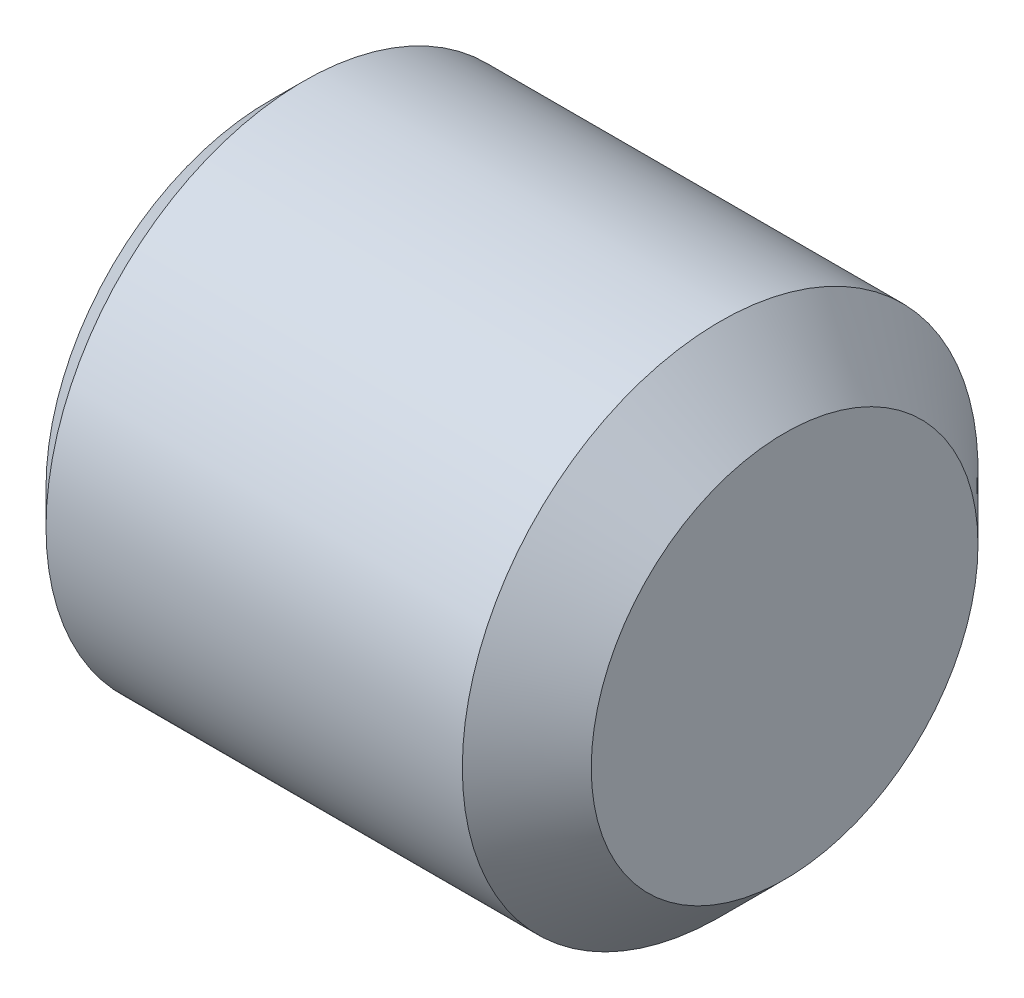
ISO-10303-21;
HEADER;
FILE_DESCRIPTION(('STEP AP214'),'2;1');
FILE_NAME('part.step','',(''),(''),'','','');
FILE_SCHEMA(('AUTOMOTIVE_DESIGN { 1 0 10303 214 1 1 1 1 }'));
ENDSEC;
DATA;
#1=APPLICATION_CONTEXT('core data for automotive mechanical design processes');
#2=APPLICATION_PROTOCOL_DEFINITION('international standard','automotive_design',2000,#1);
#3=PRODUCT_CONTEXT('',#1,'mechanical');
#4=PRODUCT('Part','Part','',(#3));
#5=PRODUCT_RELATED_PRODUCT_CATEGORY('part','',(#4));
#6=PRODUCT_DEFINITION_FORMATION('','',#4);
#7=PRODUCT_DEFINITION_CONTEXT('part definition',#1,'design');
#8=PRODUCT_DEFINITION('design','',#6,#7);
#9=PRODUCT_DEFINITION_SHAPE('','',#8);
#10=(LENGTH_UNIT() NAMED_UNIT(*) SI_UNIT(.MILLI.,.METRE.));
#11=(NAMED_UNIT(*) PLANE_ANGLE_UNIT() SI_UNIT($,.RADIAN.));
#12=(NAMED_UNIT(*) SI_UNIT($,.STERADIAN.) SOLID_ANGLE_UNIT());
#13=UNCERTAINTY_MEASURE_WITH_UNIT(LENGTH_MEASURE(1.E-05),#10,'distance_accuracy_value','');
#14=(GEOMETRIC_REPRESENTATION_CONTEXT(3) GLOBAL_UNCERTAINTY_ASSIGNED_CONTEXT((#13)) GLOBAL_UNIT_ASSIGNED_CONTEXT((#10,
#11,#12)) REPRESENTATION_CONTEXT('',''));
#15=CARTESIAN_POINT('',(0.,0.,0.));
#16=DIRECTION('',(0.,0.,1.));
#17=DIRECTION('',(1.,0.,0.));
#18=AXIS2_PLACEMENT_3D('',#15,#16,#17);
#19=CARTESIAN_POINT('',(8.00000000011369,0.,5.77350269189626));
#20=DIRECTION('',(-1.,0.,0.));
#21=DIRECTION('',(0.,0.,1.));
#22=AXIS2_PLACEMENT_3D('',#19,#20,#21);
#23=PLANE('',#22);
#24=CARTESIAN_POINT('',(8.00000000011369,0.,0.));
#25=DIRECTION('',(-1.,0.,0.));
#26=DIRECTION('',(0.,0.,1.));
#27=AXIS2_PLACEMENT_3D('',#24,#25,#26);
#28=CIRCLE('',#27,5.);
#29=CARTESIAN_POINT('',(8.00000000011369,2.5,4.33012701892219));
#30=VERTEX_POINT('',#29);
#31=CARTESIAN_POINT('',(8.00000000011369,5.,0.));
#32=VERTEX_POINT('',#31);
#33=EDGE_CURVE('E54',#30,#32,#28,.T.);
#34=ORIENTED_EDGE('',*,*,#33,.F.);
#35=DIRECTION('',(0.,0.866025403784438,-0.5));
#36=VECTOR('',#35,1.);
#37=CARTESIAN_POINT('',(8.00000000011369,0.,5.77350269189626));
#38=LINE('',#37,#36);
#39=CARTESIAN_POINT('',(8.00000000011369,5.,2.88675134594813));
#40=VERTEX_POINT('',#39);
#41=EDGE_CURVE('E244',#30,#40,#38,.T.);
#42=ORIENTED_EDGE('',*,*,#41,.T.);
#43=DIRECTION('',(0.,0.,-1.));
#44=VECTOR('',#43,1.);
#45=CARTESIAN_POINT('',(8.00000000011369,5.,2.88675134594813));
#46=LINE('',#45,#44);
#47=EDGE_CURVE('E237',#40,#32,#46,.T.);
#48=ORIENTED_EDGE('',*,*,#47,.T.);
#49=EDGE_LOOP('',(#34,#42,#48));
#50=FACE_BOUND('',#49,.T.);
#51=ADVANCED_FACE('F43',(#50),#23,.T.);
#52=CARTESIAN_POINT('',(8.00000000011369,2.5,-4.3301270189222));
#53=VERTEX_POINT('',#52);
#54=EDGE_CURVE('E11',#32,#53,#28,.T.);
#55=ORIENTED_EDGE('',*,*,#54,.F.);
#56=CARTESIAN_POINT('',(8.00000000011369,5.,-2.88675134594813));
#57=VERTEX_POINT('',#56);
#58=EDGE_CURVE('E240',#32,#57,#46,.T.);
#59=ORIENTED_EDGE('',*,*,#58,.T.);
#60=DIRECTION('',(0.,-0.866025403784439,-0.5));
#61=VECTOR('',#60,1.);
#62=CARTESIAN_POINT('',(8.00000000011369,5.,-2.88675134594813));
#63=LINE('',#62,#61);
#64=EDGE_CURVE('E233',#57,#53,#63,.T.);
#65=ORIENTED_EDGE('',*,*,#64,.T.);
#66=EDGE_LOOP('',(#55,#59,#65));
#67=FACE_BOUND('',#66,.T.);
#68=ADVANCED_FACE('F130',(#67),#23,.T.);
#69=CARTESIAN_POINT('',(8.00000000011369,-2.5,-4.3301270189222));
#70=VERTEX_POINT('',#69);
#71=EDGE_CURVE('E52',#53,#70,#28,.T.);
#72=ORIENTED_EDGE('',*,*,#71,.F.);
#73=CARTESIAN_POINT('',(8.00000000011369,0.,-5.77350269189626));
#74=VERTEX_POINT('',#73);
#75=EDGE_CURVE('E236',#53,#74,#63,.T.);
#76=ORIENTED_EDGE('',*,*,#75,.T.);
#77=DIRECTION('',(0.,-0.866025403784439,0.5));
#78=VECTOR('',#77,1.);
#79=CARTESIAN_POINT('',(8.00000000011369,0.,-5.77350269189626));
#80=LINE('',#79,#78);
#81=EDGE_CURVE('E229',#74,#70,#80,.T.);
#82=ORIENTED_EDGE('',*,*,#81,.T.);
#83=EDGE_LOOP('',(#72,#76,#82));
#84=FACE_BOUND('',#83,.T.);
#85=ADVANCED_FACE('F136',(#84),#23,.T.);
#86=CARTESIAN_POINT('',(8.00000000011369,-5.,0.));
#87=VERTEX_POINT('',#86);
#88=EDGE_CURVE('E267',#70,#87,#28,.T.);
#89=ORIENTED_EDGE('',*,*,#88,.F.);
#90=CARTESIAN_POINT('',(8.00000000011369,-5.,-2.88675134594813));
#91=VERTEX_POINT('',#90);
#92=EDGE_CURVE('E232',#70,#91,#80,.T.);
#93=ORIENTED_EDGE('',*,*,#92,.T.);
#94=DIRECTION('',(0.,0.,1.));
#95=VECTOR('',#94,1.);
#96=CARTESIAN_POINT('',(8.00000000011369,-5.,-2.88675134594813));
#97=LINE('',#96,#95);
#98=EDGE_CURVE('E200',#91,#87,#97,.T.);
#99=ORIENTED_EDGE('',*,*,#98,.T.);
#100=EDGE_LOOP('',(#89,#93,#99));
#101=FACE_BOUND('',#100,.T.);
#102=ADVANCED_FACE('F275',(#101),#23,.T.);
#103=CARTESIAN_POINT('',(8.00000000011369,-2.5,4.3301270189222));
#104=VERTEX_POINT('',#103);
#105=EDGE_CURVE('E61',#87,#104,#28,.T.);
#106=ORIENTED_EDGE('',*,*,#105,.F.);
#107=CARTESIAN_POINT('',(8.00000000011369,-5.,2.88675134594813));
#108=VERTEX_POINT('',#107);
#109=EDGE_CURVE('E228',#87,#108,#97,.T.);
#110=ORIENTED_EDGE('',*,*,#109,.T.);
#111=DIRECTION('',(0.,0.866025403784439,0.5));
#112=VECTOR('',#111,1.);
#113=CARTESIAN_POINT('',(8.00000000011369,-5.,2.88675134594813));
#114=LINE('',#113,#112);
#115=EDGE_CURVE('E245',#108,#104,#114,.T.);
#116=ORIENTED_EDGE('',*,*,#115,.T.);
#117=EDGE_LOOP('',(#106,#110,#116));
#118=FACE_BOUND('',#117,.T.);
#119=ADVANCED_FACE('F128',(#118),#23,.T.);
#120=CARTESIAN_POINT('',(0.,8.647,0.));
#121=DIRECTION('',(1.,0.,0.));
#122=DIRECTION('',(0.,0.,-1.));
#123=AXIS2_PLACEMENT_3D('',#120,#121,#122);
#124=PLANE('',#123);
#125=DIRECTION('',(0.,0.866025403784438,-0.5));
#126=VECTOR('',#125,1.);
#127=CARTESIAN_POINT('',(1.13686837721616E-10,0.,5.77350269189626));
#128=LINE('',#127,#126);
#129=CARTESIAN_POINT('',(0.,0.,5.77350269189626));
#130=VERTEX_POINT('',#129);
#131=CARTESIAN_POINT('',(1.13686837721616E-10,5.,2.88675134594813));
#132=VERTEX_POINT('',#131);
#133=EDGE_CURVE('E222',#130,#132,#128,.T.);
#134=ORIENTED_EDGE('',*,*,#133,.F.);
#135=DIRECTION('',(0.,0.866025403784439,0.5));
#136=VECTOR('',#135,1.);
#137=CARTESIAN_POINT('',(1.13686837721616E-10,-5.,2.88675134594813));
#138=LINE('',#137,#136);
#139=CARTESIAN_POINT('',(1.13686837721616E-10,-5.,2.88675134594813));
#140=VERTEX_POINT('',#139);
#141=EDGE_CURVE('E69',#140,#130,#138,.T.);
#142=ORIENTED_EDGE('',*,*,#141,.F.);
#143=DIRECTION('',(0.,0.,1.));
#144=VECTOR('',#143,1.);
#145=CARTESIAN_POINT('',(1.13686837721616E-10,-5.,-2.88675134594813));
#146=LINE('',#145,#144);
#147=CARTESIAN_POINT('',(1.13686837721616E-10,-5.,-2.88675134594813));
#148=VERTEX_POINT('',#147);
#149=EDGE_CURVE('E209',#148,#140,#146,.T.);
#150=ORIENTED_EDGE('',*,*,#149,.F.);
#151=DIRECTION('',(0.,-0.866025403784439,0.5));
#152=VECTOR('',#151,1.);
#153=CARTESIAN_POINT('',(1.13686837721616E-10,0.,-5.77350269189626));
#154=LINE('',#153,#152);
#155=CARTESIAN_POINT('',(1.13686837721616E-10,0.,-5.77350269189626));
#156=VERTEX_POINT('',#155);
#157=EDGE_CURVE('E213',#156,#148,#154,.T.);
#158=ORIENTED_EDGE('',*,*,#157,.F.);
#159=DIRECTION('',(0.,-0.866025403784439,-0.5));
#160=VECTOR('',#159,1.);
#161=CARTESIAN_POINT('',(1.13686837721616E-10,5.,-2.88675134594813));
#162=LINE('',#161,#160);
#163=CARTESIAN_POINT('',(1.13686837721616E-10,5.,-2.88675134594813));
#164=VERTEX_POINT('',#163);
#165=EDGE_CURVE('E216',#164,#156,#162,.T.);
#166=ORIENTED_EDGE('',*,*,#165,.F.);
#167=DIRECTION('',(0.,0.,-1.));
#168=VECTOR('',#167,1.);
#169=CARTESIAN_POINT('',(1.13686837721616E-10,5.,2.88675134594813));
#170=LINE('',#169,#168);
#171=EDGE_CURVE('E219',#132,#164,#170,.T.);
#172=ORIENTED_EDGE('',*,*,#171,.F.);
#173=EDGE_LOOP('',(#134,#142,#150,#158,#166,#172));
#174=FACE_BOUND('',#173,.T.);
#175=CARTESIAN_POINT('',(0.,0.,0.));
#176=DIRECTION('',(-1.,0.,0.));
#177=DIRECTION('',(0.,0.,1.));
#178=AXIS2_PLACEMENT_3D('',#175,#176,#177);
#179=CIRCLE('',#178,8.647);
#180=CARTESIAN_POINT('',(0.,0.,8.647));
#181=VERTEX_POINT('',#180);
#182=EDGE_CURVE('E190',#181,#181,#179,.T.);
#183=ORIENTED_EDGE('',*,*,#182,.T.);
#184=EDGE_LOOP('',(#183));
#185=FACE_BOUND('',#184,.T.);
#186=ADVANCED_FACE('F45',(#174,#185),#124,.F.);
#187=CARTESIAN_POINT('',(20.,0.,0.));
#188=DIRECTION('',(-1.,0.,0.));
#189=DIRECTION('',(0.,0.,1.));
#190=AXIS2_PLACEMENT_3D('',#187,#188,#189);
#191=PLANE('',#190);
#192=CARTESIAN_POINT('',(20.,0.,0.));
#193=DIRECTION('',(-1.,0.,0.));
#194=DIRECTION('',(0.,0.,1.));
#195=AXIS2_PLACEMENT_3D('',#192,#193,#194);
#196=CIRCLE('',#195,7.5);
#197=CARTESIAN_POINT('',(20.,0.,7.5));
#198=VERTEX_POINT('',#197);
#199=EDGE_CURVE('E47',#198,#198,#196,.T.);
#200=ORIENTED_EDGE('',*,*,#199,.F.);
#201=EDGE_LOOP('',(#200));
#202=FACE_BOUND('',#201,.T.);
#203=ADVANCED_FACE('F172',(#202),#191,.F.);
#204=CARTESIAN_POINT('',(20.,0.,0.));
#205=DIRECTION('',(-1.,0.,0.));
#206=DIRECTION('',(0.,0.,1.));
#207=AXIS2_PLACEMENT_3D('',#204,#205,#206);
#208=CONICAL_SURFACE('',#207,7.5,0.785398163397444);
#209=CARTESIAN_POINT('',(17.5,0.,0.));
#210=DIRECTION('',(-1.,0.,0.));
#211=DIRECTION('',(0.,0.,1.));
#212=AXIS2_PLACEMENT_3D('',#209,#210,#211);
#213=CIRCLE('',#212,10.);
#214=CARTESIAN_POINT('',(17.5,0.,10.));
#215=VERTEX_POINT('',#214);
#216=EDGE_CURVE('E184',#215,#215,#213,.T.);
#217=ORIENTED_EDGE('',*,*,#216,.F.);
#218=EDGE_LOOP('',(#217));
#219=FACE_BOUND('',#218,.T.);
#220=ORIENTED_EDGE('',*,*,#199,.T.);
#221=EDGE_LOOP('',(#220));
#222=FACE_BOUND('',#221,.T.);
#223=ADVANCED_FACE('F169',(#219,#222),#208,.T.);
#224=CARTESIAN_POINT('',(-10.7450145430878,0.,0.));
#225=DIRECTION('',(-1.,0.,0.));
#226=DIRECTION('',(0.,0.,1.));
#227=AXIS2_PLACEMENT_3D('',#224,#225,#226);
#228=CYLINDRICAL_SURFACE('',#227,10.);
#229=CARTESIAN_POINT('',(1.35300000000001,0.,0.));
#230=DIRECTION('',(-1.,0.,0.));
#231=DIRECTION('',(0.,0.,1.));
#232=AXIS2_PLACEMENT_3D('',#229,#230,#231);
#233=CIRCLE('',#232,10.);
#234=CARTESIAN_POINT('',(1.35300000000001,0.,10.));
#235=VERTEX_POINT('',#234);
#236=EDGE_CURVE('E186',#235,#235,#233,.T.);
#237=ORIENTED_EDGE('',*,*,#236,.F.);
#238=EDGE_LOOP('',(#237));
#239=FACE_BOUND('',#238,.T.);
#240=ORIENTED_EDGE('',*,*,#216,.T.);
#241=EDGE_LOOP('',(#240));
#242=FACE_BOUND('',#241,.T.);
#243=ADVANCED_FACE('F165',(#239,#242),#228,.T.);
#244=CARTESIAN_POINT('',(1.35300000000001,0.,0.));
#245=DIRECTION('',(1.,0.,0.));
#246=DIRECTION('',(0.,0.,-1.));
#247=AXIS2_PLACEMENT_3D('',#244,#245,#246);
#248=CONICAL_SURFACE('',#247,10.,0.785398163397443);
#249=ORIENTED_EDGE('',*,*,#182,.F.);
#250=EDGE_LOOP('',(#249));
#251=FACE_BOUND('',#250,.T.);
#252=ORIENTED_EDGE('',*,*,#236,.T.);
#253=EDGE_LOOP('',(#252));
#254=FACE_BOUND('',#253,.T.);
#255=ADVANCED_FACE('F162',(#251,#254),#248,.T.);
#256=CARTESIAN_POINT('',(8.00000000011369,-5.,2.88675134594813));
#257=DIRECTION('',(0.,-0.5,0.866025403784439));
#258=DIRECTION('',(0.,-0.866025403784439,-0.5));
#259=AXIS2_PLACEMENT_3D('',#256,#257,#258);
#260=PLANE('',#259);
#261=ORIENTED_EDGE('',*,*,#141,.T.);
#262=DIRECTION('',(-1.,0.,0.));
#263=VECTOR('',#262,1.);
#264=CARTESIAN_POINT('',(8.00000000011369,0.,5.77350269189626));
#265=LINE('',#264,#263);
#266=CARTESIAN_POINT('',(8.00000000011369,0.,5.77350269189626));
#267=VERTEX_POINT('',#266);
#268=EDGE_CURVE('E197',#267,#130,#265,.T.);
#269=ORIENTED_EDGE('',*,*,#268,.F.);
#270=EDGE_CURVE('E212',#104,#267,#114,.T.);
#271=ORIENTED_EDGE('',*,*,#270,.F.);
#272=ORIENTED_EDGE('',*,*,#115,.F.);
#273=DIRECTION('',(-1.,0.,0.));
#274=VECTOR('',#273,1.);
#275=CARTESIAN_POINT('',(8.00000000011369,-5.,2.88675134594813));
#276=LINE('',#275,#274);
#277=EDGE_CURVE('E196',#108,#140,#276,.T.);
#278=ORIENTED_EDGE('',*,*,#277,.T.);
#279=EDGE_LOOP('',(#261,#269,#271,#272,#278));
#280=FACE_BOUND('',#279,.T.);
#281=ADVANCED_FACE('F144',(#280),#260,.F.);
#282=CARTESIAN_POINT('',(8.00000000011369,-5.,-2.88675134594813));
#283=DIRECTION('',(0.,-1.,0.));
#284=DIRECTION('',(0.,0.,-1.));
#285=AXIS2_PLACEMENT_3D('',#282,#283,#284);
#286=PLANE('',#285);
#287=ORIENTED_EDGE('',*,*,#149,.T.);
#288=ORIENTED_EDGE('',*,*,#277,.F.);
#289=ORIENTED_EDGE('',*,*,#109,.F.);
#290=ORIENTED_EDGE('',*,*,#98,.F.);
#291=DIRECTION('',(-1.,0.,0.));
#292=VECTOR('',#291,1.);
#293=CARTESIAN_POINT('',(8.00000000011369,-5.,-2.88675134594813));
#294=LINE('',#293,#292);
#295=EDGE_CURVE('E206',#91,#148,#294,.T.);
#296=ORIENTED_EDGE('',*,*,#295,.T.);
#297=EDGE_LOOP('',(#287,#288,#289,#290,#296));
#298=FACE_BOUND('',#297,.T.);
#299=ADVANCED_FACE('F140',(#298),#286,.F.);
#300=CARTESIAN_POINT('',(8.00000000011369,0.,-5.77350269189626));
#301=DIRECTION('',(0.,-0.5,-0.866025403784439));
#302=DIRECTION('',(0.,0.866025403784439,-0.5));
#303=AXIS2_PLACEMENT_3D('',#300,#301,#302);
#304=PLANE('',#303);
#305=ORIENTED_EDGE('',*,*,#157,.T.);
#306=ORIENTED_EDGE('',*,*,#295,.F.);
#307=ORIENTED_EDGE('',*,*,#92,.F.);
#308=ORIENTED_EDGE('',*,*,#81,.F.);
#309=DIRECTION('',(-1.,0.,0.));
#310=VECTOR('',#309,1.);
#311=CARTESIAN_POINT('',(8.00000000011369,0.,-5.77350269189626));
#312=LINE('',#311,#310);
#313=EDGE_CURVE('E204',#74,#156,#312,.T.);
#314=ORIENTED_EDGE('',*,*,#313,.T.);
#315=EDGE_LOOP('',(#305,#306,#307,#308,#314));
#316=FACE_BOUND('',#315,.T.);
#317=ADVANCED_FACE('F143',(#316),#304,.F.);
#318=CARTESIAN_POINT('',(8.00000000011369,5.,-2.88675134594813));
#319=DIRECTION('',(0.,0.5,-0.866025403784439));
#320=DIRECTION('',(0.,0.866025403784439,0.5));
#321=AXIS2_PLACEMENT_3D('',#318,#319,#320);
#322=PLANE('',#321);
#323=ORIENTED_EDGE('',*,*,#165,.T.);
#324=ORIENTED_EDGE('',*,*,#313,.F.);
#325=ORIENTED_EDGE('',*,*,#75,.F.);
#326=ORIENTED_EDGE('',*,*,#64,.F.);
#327=DIRECTION('',(-1.,0.,0.));
#328=VECTOR('',#327,1.);
#329=CARTESIAN_POINT('',(8.00000000011369,5.,-2.88675134594813));
#330=LINE('',#329,#328);
#331=EDGE_CURVE('E202',#57,#164,#330,.T.);
#332=ORIENTED_EDGE('',*,*,#331,.T.);
#333=EDGE_LOOP('',(#323,#324,#325,#326,#332));
#334=FACE_BOUND('',#333,.T.);
#335=ADVANCED_FACE('F148',(#334),#322,.F.);
#336=CARTESIAN_POINT('',(8.00000000011369,5.,2.88675134594813));
#337=DIRECTION('',(0.,1.,0.));
#338=DIRECTION('',(0.,0.,1.));
#339=AXIS2_PLACEMENT_3D('',#336,#337,#338);
#340=PLANE('',#339);
#341=ORIENTED_EDGE('',*,*,#171,.T.);
#342=ORIENTED_EDGE('',*,*,#331,.F.);
#343=ORIENTED_EDGE('',*,*,#58,.F.);
#344=ORIENTED_EDGE('',*,*,#47,.F.);
#345=DIRECTION('',(-1.,0.,0.));
#346=VECTOR('',#345,1.);
#347=CARTESIAN_POINT('',(8.00000000011369,5.,2.88675134594813));
#348=LINE('',#347,#346);
#349=EDGE_CURVE('E199',#40,#132,#348,.T.);
#350=ORIENTED_EDGE('',*,*,#349,.T.);
#351=EDGE_LOOP('',(#341,#342,#343,#344,#350));
#352=FACE_BOUND('',#351,.T.);
#353=ADVANCED_FACE('F152',(#352),#340,.F.);
#354=CARTESIAN_POINT('',(8.00000000011369,0.,5.77350269189626));
#355=DIRECTION('',(0.,0.5,0.866025403784439));
#356=DIRECTION('',(0.,-0.866025403784438,0.5));
#357=AXIS2_PLACEMENT_3D('',#354,#355,#356);
#358=PLANE('',#357);
#359=ORIENTED_EDGE('',*,*,#133,.T.);
#360=ORIENTED_EDGE('',*,*,#349,.F.);
#361=ORIENTED_EDGE('',*,*,#41,.F.);
#362=EDGE_CURVE('E241',#267,#30,#38,.T.);
#363=ORIENTED_EDGE('',*,*,#362,.F.);
#364=ORIENTED_EDGE('',*,*,#268,.T.);
#365=EDGE_LOOP('',(#359,#360,#361,#363,#364));
#366=FACE_BOUND('',#365,.T.);
#367=ADVANCED_FACE('F125',(#366),#358,.F.);
#368=EDGE_CURVE('E183',#104,#30,#28,.T.);
#369=ORIENTED_EDGE('',*,*,#368,.F.);
#370=ORIENTED_EDGE('',*,*,#270,.T.);
#371=ORIENTED_EDGE('',*,*,#362,.T.);
#372=EDGE_LOOP('',(#369,#370,#371));
#373=FACE_BOUND('',#372,.T.);
#374=ADVANCED_FACE('F120',(#373),#23,.T.);
#375=CARTESIAN_POINT('',(10.8867513460618,0.,0.));
#376=DIRECTION('',(-1.,0.,0.));
#377=DIRECTION('',(0.,0.,1.));
#378=AXIS2_PLACEMENT_3D('',#375,#376,#377);
#379=CONICAL_SURFACE('',#378,0.,1.0471975511966);
#380=ORIENTED_EDGE('',*,*,#33,.T.);
#381=ORIENTED_EDGE('',*,*,#54,.T.);
#382=ORIENTED_EDGE('',*,*,#71,.T.);
#383=ORIENTED_EDGE('',*,*,#88,.T.);
#384=ORIENTED_EDGE('',*,*,#105,.T.);
#385=ORIENTED_EDGE('',*,*,#368,.T.);
#386=EDGE_LOOP('',(#380,#381,#382,#383,#384,#385));
#387=FACE_BOUND('',#386,.T.);
#388=CARTESIAN_POINT('',(10.8867513460618,0.,0.));
#389=VERTEX_POINT('',#388);
#390=VERTEX_LOOP('',#389);
#391=FACE_BOUND('',#390,.T.);
#392=ADVANCED_FACE('F118',(#387,#391),#379,.F.);
#393=CLOSED_SHELL('',(#51,#68,#85,#102,#119,#186,#203,#223,#243,#255,#281,#299,#317,#335,#353,
#367,#374,#392));
#394=MANIFOLD_SOLID_BREP('B2',#393);
#395=ADVANCED_BREP_SHAPE_REPRESENTATION('',(#18,#394),#14);
#396=SHAPE_DEFINITION_REPRESENTATION(#9,#395);
ENDSEC;
END-ISO-10303-21;
